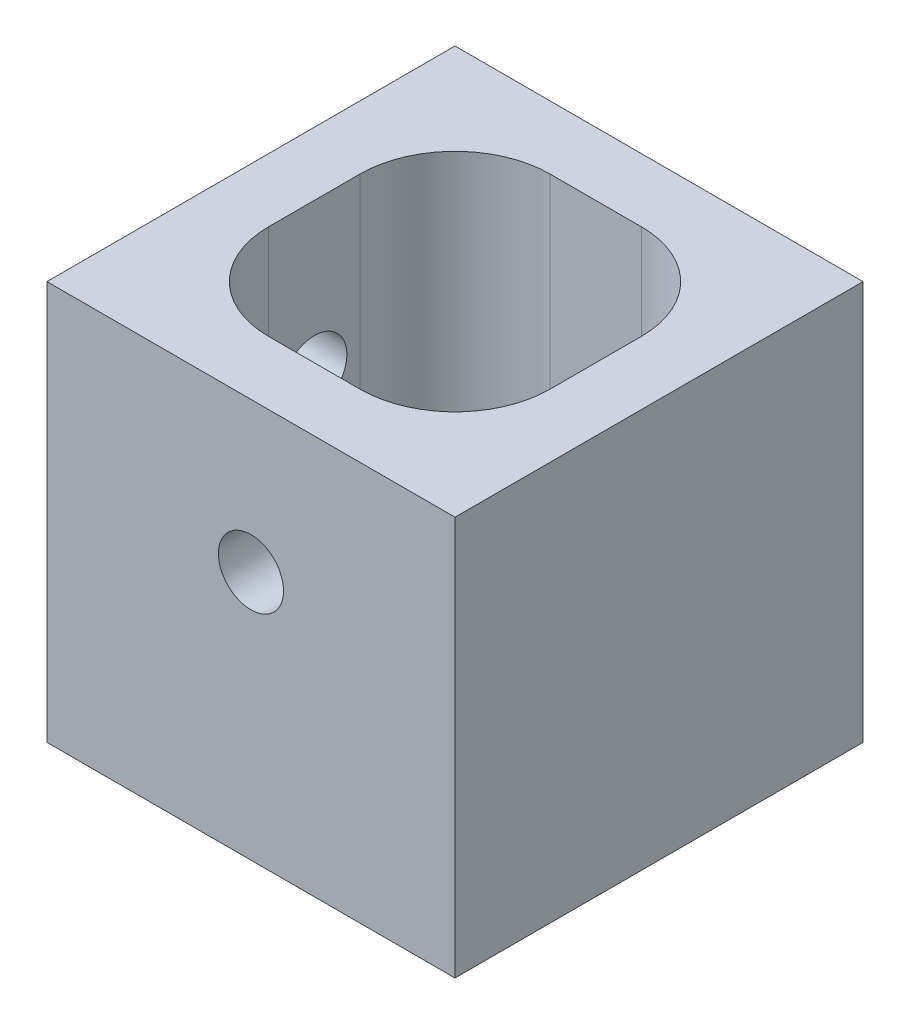
ISO-10303-21;
HEADER;
FILE_DESCRIPTION(('STEP AP214'),'2;1');
FILE_NAME('part.step','',(''),(''),'','','');
FILE_SCHEMA(('AUTOMOTIVE_DESIGN { 1 0 10303 214 1 1 1 1 }'));
ENDSEC;
DATA;
#1=APPLICATION_CONTEXT('core data for automotive mechanical design processes');
#2=APPLICATION_PROTOCOL_DEFINITION('international standard','automotive_design',2000,#1);
#3=PRODUCT_CONTEXT('',#1,'mechanical');
#4=PRODUCT('Part','Part','',(#3));
#5=PRODUCT_RELATED_PRODUCT_CATEGORY('part','',(#4));
#6=PRODUCT_DEFINITION_FORMATION('','',#4);
#7=PRODUCT_DEFINITION_CONTEXT('part definition',#1,'design');
#8=PRODUCT_DEFINITION('design','',#6,#7);
#9=PRODUCT_DEFINITION_SHAPE('','',#8);
#10=(LENGTH_UNIT() NAMED_UNIT(*) SI_UNIT(.MILLI.,.METRE.));
#11=(NAMED_UNIT(*) PLANE_ANGLE_UNIT() SI_UNIT($,.RADIAN.));
#12=(NAMED_UNIT(*) SI_UNIT($,.STERADIAN.) SOLID_ANGLE_UNIT());
#13=UNCERTAINTY_MEASURE_WITH_UNIT(LENGTH_MEASURE(1.E-05),#10,'distance_accuracy_value','');
#14=(GEOMETRIC_REPRESENTATION_CONTEXT(3) GLOBAL_UNCERTAINTY_ASSIGNED_CONTEXT((#13)) GLOBAL_UNIT_ASSIGNED_CONTEXT((#10,
#11,#12)) REPRESENTATION_CONTEXT('',''));
#15=CARTESIAN_POINT('',(0.,0.,0.));
#16=DIRECTION('',(0.,0.,1.));
#17=DIRECTION('',(1.,0.,0.));
#18=AXIS2_PLACEMENT_3D('',#15,#16,#17);
#19=CARTESIAN_POINT('',(0.,9.525,0.));
#20=DIRECTION('',(0.,-1.,0.));
#21=DIRECTION('',(0.,0.,-1.));
#22=AXIS2_PLACEMENT_3D('',#19,#20,#21);
#23=PLANE('',#22);
#24=CARTESIAN_POINT('',(-9.525,9.525,-9.525));
#25=DIRECTION('',(0.,1.,0.));
#26=DIRECTION('',(0.,0.,1.));
#27=AXIS2_PLACEMENT_3D('',#24,#25,#26);
#28=CIRCLE('',#27,2.55269999999999);
#29=CARTESIAN_POINT('',(-11.6142272356544,9.525,-10.9917674825275));
#30=VERTEX_POINT('',#29);
#31=CARTESIAN_POINT('',(-10.9917674825275,9.525,-11.6142272356544));
#32=VERTEX_POINT('',#31);
#33=EDGE_CURVE('E158',#30,#32,#28,.T.);
#34=ORIENTED_EDGE('',*,*,#33,.F.);
#35=CARTESIAN_POINT('',(-4.575,9.525,-4.575));
#36=DIRECTION('',(0.,-1.,0.));
#37=DIRECTION('',(0.,0.,-1.));
#38=AXIS2_PLACEMENT_3D('',#35,#36,#37);
#39=CIRCLE('',#38,9.525);
#40=CARTESIAN_POINT('',(-14.1,9.525,-4.575));
#41=VERTEX_POINT('',#40);
#42=EDGE_CURVE('E152',#30,#41,#39,.F.);
#43=ORIENTED_EDGE('',*,*,#42,.T.);
#44=DIRECTION('',(0.,0.,1.));
#45=VECTOR('',#44,1.);
#46=CARTESIAN_POINT('',(-14.1,9.525,14.1));
#47=LINE('',#46,#45);
#48=CARTESIAN_POINT('',(-14.1,9.525,4.575));
#49=VERTEX_POINT('',#48);
#50=EDGE_CURVE('E263',#41,#49,#47,.T.);
#51=ORIENTED_EDGE('',*,*,#50,.T.);
#52=CARTESIAN_POINT('',(-4.575,9.525,4.575));
#53=DIRECTION('',(0.,-1.,0.));
#54=DIRECTION('',(0.,0.,-1.));
#55=AXIS2_PLACEMENT_3D('',#52,#53,#54);
#56=CIRCLE('',#55,9.525);
#57=CARTESIAN_POINT('',(-11.6142272356544,9.525,10.9917674825274));
#58=VERTEX_POINT('',#57);
#59=EDGE_CURVE('E184',#49,#58,#56,.F.);
#60=ORIENTED_EDGE('',*,*,#59,.T.);
#61=CARTESIAN_POINT('',(-9.525,9.525,9.525));
#62=DIRECTION('',(0.,1.,0.));
#63=DIRECTION('',(0.,0.,1.));
#64=AXIS2_PLACEMENT_3D('',#61,#62,#63);
#65=CIRCLE('',#64,2.55269999999999);
#66=CARTESIAN_POINT('',(-10.9917674825275,9.525,11.6142272356543));
#67=VERTEX_POINT('',#66);
#68=EDGE_CURVE('E360',#67,#58,#65,.T.);
#69=ORIENTED_EDGE('',*,*,#68,.F.);
#70=CARTESIAN_POINT('',(-4.575,9.525,14.1));
#71=VERTEX_POINT('',#70);
#72=EDGE_CURVE('E180',#67,#71,#56,.F.);
#73=ORIENTED_EDGE('',*,*,#72,.T.);
#74=DIRECTION('',(1.,0.,0.));
#75=VECTOR('',#74,1.);
#76=CARTESIAN_POINT('',(14.1,9.525,14.1));
#77=LINE('',#76,#75);
#78=CARTESIAN_POINT('',(4.575,9.525,14.1));
#79=VERTEX_POINT('',#78);
#80=EDGE_CURVE('E253',#71,#79,#77,.T.);
#81=ORIENTED_EDGE('',*,*,#80,.T.);
#82=CARTESIAN_POINT('',(4.575,9.525,4.575));
#83=DIRECTION('',(0.,-1.,0.));
#84=DIRECTION('',(0.,0.,-1.));
#85=AXIS2_PLACEMENT_3D('',#82,#83,#84);
#86=CIRCLE('',#85,9.525);
#87=CARTESIAN_POINT('',(10.9917674825275,9.525,11.6142272356544));
#88=VERTEX_POINT('',#87);
#89=EDGE_CURVE('E195',#79,#88,#86,.F.);
#90=ORIENTED_EDGE('',*,*,#89,.T.);
#91=CARTESIAN_POINT('',(9.525,9.525,9.525));
#92=DIRECTION('',(0.,1.,0.));
#93=DIRECTION('',(0.,0.,1.));
#94=AXIS2_PLACEMENT_3D('',#91,#92,#93);
#95=CIRCLE('',#94,2.55269999999999);
#96=CARTESIAN_POINT('',(11.6142272356544,9.525,10.9917674825274));
#97=VERTEX_POINT('',#96);
#98=EDGE_CURVE('E582',#97,#88,#95,.T.);
#99=ORIENTED_EDGE('',*,*,#98,.F.);
#100=CARTESIAN_POINT('',(14.1,9.525,4.575));
#101=VERTEX_POINT('',#100);
#102=EDGE_CURVE('E192',#97,#101,#86,.F.);
#103=ORIENTED_EDGE('',*,*,#102,.T.);
#104=DIRECTION('',(0.,0.,-1.));
#105=VECTOR('',#104,1.);
#106=CARTESIAN_POINT('',(14.1,9.525,14.1));
#107=LINE('',#106,#105);
#108=CARTESIAN_POINT('',(14.1,9.525,-4.575));
#109=VERTEX_POINT('',#108);
#110=EDGE_CURVE('E262',#101,#109,#107,.T.);
#111=ORIENTED_EDGE('',*,*,#110,.T.);
#112=CARTESIAN_POINT('',(4.575,9.525,-4.575));
#113=DIRECTION('',(0.,-1.,0.));
#114=DIRECTION('',(0.,0.,-1.));
#115=AXIS2_PLACEMENT_3D('',#112,#113,#114);
#116=CIRCLE('',#115,9.525);
#117=CARTESIAN_POINT('',(11.6142272356544,9.525,-10.9917674825274));
#118=VERTEX_POINT('',#117);
#119=EDGE_CURVE('E174',#109,#118,#116,.F.);
#120=ORIENTED_EDGE('',*,*,#119,.T.);
#121=CARTESIAN_POINT('',(9.525,9.525,-9.525));
#122=DIRECTION('',(0.,1.,0.));
#123=DIRECTION('',(0.,0.,1.));
#124=AXIS2_PLACEMENT_3D('',#121,#122,#123);
#125=CIRCLE('',#124,2.55269999999999);
#126=CARTESIAN_POINT('',(10.9917674825275,9.525,-11.6142272356544));
#127=VERTEX_POINT('',#126);
#128=EDGE_CURVE('E589',#127,#118,#125,.T.);
#129=ORIENTED_EDGE('',*,*,#128,.F.);
#130=CARTESIAN_POINT('',(4.575,9.525,-14.1));
#131=VERTEX_POINT('',#130);
#132=EDGE_CURVE('E172',#127,#131,#116,.F.);
#133=ORIENTED_EDGE('',*,*,#132,.T.);
#134=DIRECTION('',(-1.,0.,0.));
#135=VECTOR('',#134,1.);
#136=CARTESIAN_POINT('',(14.1,9.525,-14.1));
#137=LINE('',#136,#135);
#138=CARTESIAN_POINT('',(-4.575,9.525,-14.1));
#139=VERTEX_POINT('',#138);
#140=EDGE_CURVE('E266',#131,#139,#137,.T.);
#141=ORIENTED_EDGE('',*,*,#140,.T.);
#142=EDGE_CURVE('E151',#139,#32,#39,.F.);
#143=ORIENTED_EDGE('',*,*,#142,.T.);
#144=EDGE_LOOP('',(#34,#43,#51,#60,#69,#73,#81,#90,#99,#103,#111,#120,#129,#133,#141,#143));
#145=FACE_BOUND('',#144,.T.);
#146=ADVANCED_FACE('F35',(#145),#23,.F.);
#147=CARTESIAN_POINT('',(20.45,40.,20.45));
#148=DIRECTION('',(-1.,0.,0.));
#149=DIRECTION('',(0.,0.,1.));
#150=AXIS2_PLACEMENT_3D('',#147,#148,#149);
#151=PLANE('',#150);
#152=DIRECTION('',(0.,0.,-1.));
#153=VECTOR('',#152,1.);
#154=CARTESIAN_POINT('',(20.45,0.,20.45));
#155=LINE('',#154,#153);
#156=CARTESIAN_POINT('',(20.45,0.,20.45));
#157=VERTEX_POINT('',#156);
#158=CARTESIAN_POINT('',(20.45,0.,-20.45));
#159=VERTEX_POINT('',#158);
#160=EDGE_CURVE('E265',#157,#159,#155,.T.);
#161=ORIENTED_EDGE('',*,*,#160,.T.);
#162=DIRECTION('',(0.,-1.,0.));
#163=VECTOR('',#162,1.);
#164=CARTESIAN_POINT('',(20.45,40.,-20.45));
#165=LINE('',#164,#163);
#166=CARTESIAN_POINT('',(20.45,40.,-20.45));
#167=VERTEX_POINT('',#166);
#168=EDGE_CURVE('E238',#167,#159,#165,.T.);
#169=ORIENTED_EDGE('',*,*,#168,.F.);
#170=DIRECTION('',(0.,0.,-1.));
#171=VECTOR('',#170,1.);
#172=CARTESIAN_POINT('',(20.45,40.,20.45));
#173=LINE('',#172,#171);
#174=CARTESIAN_POINT('',(20.45,40.,20.45));
#175=VERTEX_POINT('',#174);
#176=EDGE_CURVE('E269',#175,#167,#173,.T.);
#177=ORIENTED_EDGE('',*,*,#176,.F.);
#178=DIRECTION('',(0.,-1.,0.));
#179=VECTOR('',#178,1.);
#180=CARTESIAN_POINT('',(20.45,40.,20.45));
#181=LINE('',#180,#179);
#182=EDGE_CURVE('E279',#175,#157,#181,.T.);
#183=ORIENTED_EDGE('',*,*,#182,.T.);
#184=EDGE_LOOP('',(#161,#169,#177,#183));
#185=FACE_BOUND('',#184,.T.);
#186=ADVANCED_FACE('F309',(#185),#151,.F.);
#187=CARTESIAN_POINT('',(-20.45,40.,-20.45));
#188=DIRECTION('',(0.,0.,1.));
#189=DIRECTION('',(1.,0.,0.));
#190=AXIS2_PLACEMENT_3D('',#187,#188,#189);
#191=PLANE('',#190);
#192=DIRECTION('',(-1.,0.,0.));
#193=VECTOR('',#192,1.);
#194=CARTESIAN_POINT('',(-20.45,0.,-20.45));
#195=LINE('',#194,#193);
#196=CARTESIAN_POINT('',(-20.45,0.,-20.45));
#197=VERTEX_POINT('',#196);
#198=EDGE_CURVE('E282',#159,#197,#195,.T.);
#199=ORIENTED_EDGE('',*,*,#198,.T.);
#200=DIRECTION('',(0.,-1.,0.));
#201=VECTOR('',#200,1.);
#202=CARTESIAN_POINT('',(-20.45,40.,-20.45));
#203=LINE('',#202,#201);
#204=CARTESIAN_POINT('',(-20.45,40.,-20.45));
#205=VERTEX_POINT('',#204);
#206=EDGE_CURVE('E242',#205,#197,#203,.T.);
#207=ORIENTED_EDGE('',*,*,#206,.F.);
#208=DIRECTION('',(-1.,0.,0.));
#209=VECTOR('',#208,1.);
#210=CARTESIAN_POINT('',(-20.45,40.,-20.45));
#211=LINE('',#210,#209);
#212=EDGE_CURVE('E272',#167,#205,#211,.T.);
#213=ORIENTED_EDGE('',*,*,#212,.F.);
#214=ORIENTED_EDGE('',*,*,#168,.T.);
#215=EDGE_LOOP('',(#199,#207,#213,#214));
#216=FACE_BOUND('',#215,.T.);
#217=ADVANCED_FACE('F311',(#216),#191,.F.);
#218=CARTESIAN_POINT('',(-20.45,40.,20.45));
#219=DIRECTION('',(1.,0.,0.));
#220=DIRECTION('',(0.,0.,-1.));
#221=AXIS2_PLACEMENT_3D('',#218,#219,#220);
#222=PLANE('',#221);
#223=CARTESIAN_POINT('',(-20.45,25.,0.));
#224=DIRECTION('',(-1.,0.,0.));
#225=DIRECTION('',(0.,0.,1.));
#226=AXIS2_PLACEMENT_3D('',#223,#224,#225);
#227=CIRCLE('',#226,3.2639);
#228=CARTESIAN_POINT('',(-20.45,25.,3.26389999999993));
#229=VERTEX_POINT('',#228);
#230=EDGE_CURVE('E346',#229,#229,#227,.T.);
#231=ORIENTED_EDGE('',*,*,#230,.F.);
#232=EDGE_LOOP('',(#231));
#233=FACE_BOUND('',#232,.T.);
#234=DIRECTION('',(0.,0.,1.));
#235=VECTOR('',#234,1.);
#236=CARTESIAN_POINT('',(-20.45,0.,20.45));
#237=LINE('',#236,#235);
#238=CARTESIAN_POINT('',(-20.45,0.,20.45));
#239=VERTEX_POINT('',#238);
#240=EDGE_CURVE('E284',#197,#239,#237,.T.);
#241=ORIENTED_EDGE('',*,*,#240,.T.);
#242=DIRECTION('',(0.,-1.,0.));
#243=VECTOR('',#242,1.);
#244=CARTESIAN_POINT('',(-20.45,40.,20.45));
#245=LINE('',#244,#243);
#246=CARTESIAN_POINT('',(-20.45,40.,20.45));
#247=VERTEX_POINT('',#246);
#248=EDGE_CURVE('E289',#247,#239,#245,.T.);
#249=ORIENTED_EDGE('',*,*,#248,.F.);
#250=DIRECTION('',(0.,0.,1.));
#251=VECTOR('',#250,1.);
#252=CARTESIAN_POINT('',(-20.45,40.,20.45));
#253=LINE('',#252,#251);
#254=EDGE_CURVE('E275',#205,#247,#253,.T.);
#255=ORIENTED_EDGE('',*,*,#254,.F.);
#256=ORIENTED_EDGE('',*,*,#206,.T.);
#257=EDGE_LOOP('',(#241,#249,#255,#256));
#258=FACE_BOUND('',#257,.T.);
#259=ADVANCED_FACE('F296',(#233,#258),#222,.F.);
#260=CARTESIAN_POINT('',(-20.45,40.,20.45));
#261=DIRECTION('',(0.,0.,-1.));
#262=DIRECTION('',(-1.,0.,0.));
#263=AXIS2_PLACEMENT_3D('',#260,#261,#262);
#264=PLANE('',#263);
#265=CARTESIAN_POINT('',(0.,25.,20.45));
#266=DIRECTION('',(0.,0.,1.));
#267=DIRECTION('',(1.,0.,0.));
#268=AXIS2_PLACEMENT_3D('',#265,#266,#267);
#269=CIRCLE('',#268,3.2639);
#270=CARTESIAN_POINT('',(3.2639,25.,20.45));
#271=VERTEX_POINT('',#270);
#272=EDGE_CURVE('E339',#271,#271,#269,.T.);
#273=ORIENTED_EDGE('',*,*,#272,.F.);
#274=EDGE_LOOP('',(#273));
#275=FACE_BOUND('',#274,.T.);
#276=DIRECTION('',(1.,0.,0.));
#277=VECTOR('',#276,1.);
#278=CARTESIAN_POINT('',(-20.45,0.,20.45));
#279=LINE('',#278,#277);
#280=EDGE_CURVE('E273',#239,#157,#279,.T.);
#281=ORIENTED_EDGE('',*,*,#280,.T.);
#282=ORIENTED_EDGE('',*,*,#182,.F.);
#283=DIRECTION('',(1.,0.,0.));
#284=VECTOR('',#283,1.);
#285=CARTESIAN_POINT('',(-20.45,40.,20.45));
#286=LINE('',#285,#284);
#287=EDGE_CURVE('E277',#247,#175,#286,.T.);
#288=ORIENTED_EDGE('',*,*,#287,.F.);
#289=ORIENTED_EDGE('',*,*,#248,.T.);
#290=EDGE_LOOP('',(#281,#282,#288,#289));
#291=FACE_BOUND('',#290,.T.);
#292=ADVANCED_FACE('F305',(#275,#291),#264,.F.);
#293=CARTESIAN_POINT('',(0.,40.,0.));
#294=DIRECTION('',(0.,-1.,0.));
#295=DIRECTION('',(0.,0.,-1.));
#296=AXIS2_PLACEMENT_3D('',#293,#294,#295);
#297=PLANE('',#296);
#298=DIRECTION('',(0.,0.,-1.));
#299=VECTOR('',#298,1.);
#300=CARTESIAN_POINT('',(14.1,40.,14.1));
#301=LINE('',#300,#299);
#302=CARTESIAN_POINT('',(14.1,40.,4.575));
#303=VERTEX_POINT('',#302);
#304=CARTESIAN_POINT('',(14.1,40.,-4.575));
#305=VERTEX_POINT('',#304);
#306=EDGE_CURVE('E222',#303,#305,#301,.T.);
#307=ORIENTED_EDGE('',*,*,#306,.F.);
#308=CARTESIAN_POINT('',(4.575,40.,4.575));
#309=DIRECTION('',(0.,-1.,0.));
#310=DIRECTION('',(0.,0.,-1.));
#311=AXIS2_PLACEMENT_3D('',#308,#309,#310);
#312=CIRCLE('',#311,9.525);
#313=CARTESIAN_POINT('',(4.575,40.,14.1));
#314=VERTEX_POINT('',#313);
#315=EDGE_CURVE('E213',#303,#314,#312,.T.);
#316=ORIENTED_EDGE('',*,*,#315,.T.);
#317=DIRECTION('',(1.,0.,0.));
#318=VECTOR('',#317,1.);
#319=CARTESIAN_POINT('',(14.1,40.,14.1));
#320=LINE('',#319,#318);
#321=CARTESIAN_POINT('',(-4.575,40.,14.1));
#322=VERTEX_POINT('',#321);
#323=EDGE_CURVE('E234',#322,#314,#320,.T.);
#324=ORIENTED_EDGE('',*,*,#323,.F.);
#325=CARTESIAN_POINT('',(-4.575,40.,4.575));
#326=DIRECTION('',(0.,-1.,0.));
#327=DIRECTION('',(0.,0.,-1.));
#328=AXIS2_PLACEMENT_3D('',#325,#326,#327);
#329=CIRCLE('',#328,9.525);
#330=CARTESIAN_POINT('',(-14.1,40.,4.575));
#331=VERTEX_POINT('',#330);
#332=EDGE_CURVE('E215',#322,#331,#329,.T.);
#333=ORIENTED_EDGE('',*,*,#332,.T.);
#334=DIRECTION('',(0.,0.,1.));
#335=VECTOR('',#334,1.);
#336=CARTESIAN_POINT('',(-14.1,40.,14.1));
#337=LINE('',#336,#335);
#338=CARTESIAN_POINT('',(-14.1,40.,-4.575));
#339=VERTEX_POINT('',#338);
#340=EDGE_CURVE('E255',#339,#331,#337,.T.);
#341=ORIENTED_EDGE('',*,*,#340,.F.);
#342=CARTESIAN_POINT('',(-4.575,40.,-4.575));
#343=DIRECTION('',(0.,-1.,0.));
#344=DIRECTION('',(0.,0.,-1.));
#345=AXIS2_PLACEMENT_3D('',#342,#343,#344);
#346=CIRCLE('',#345,9.525);
#347=CARTESIAN_POINT('',(-4.575,40.,-14.1));
#348=VERTEX_POINT('',#347);
#349=EDGE_CURVE('E11',#339,#348,#346,.T.);
#350=ORIENTED_EDGE('',*,*,#349,.T.);
#351=DIRECTION('',(-1.,0.,0.));
#352=VECTOR('',#351,1.);
#353=CARTESIAN_POINT('',(14.1,40.,-14.1));
#354=LINE('',#353,#352);
#355=CARTESIAN_POINT('',(4.575,40.,-14.1));
#356=VERTEX_POINT('',#355);
#357=EDGE_CURVE('E224',#356,#348,#354,.T.);
#358=ORIENTED_EDGE('',*,*,#357,.F.);
#359=CARTESIAN_POINT('',(4.575,40.,-4.575));
#360=DIRECTION('',(0.,-1.,0.));
#361=DIRECTION('',(0.,0.,-1.));
#362=AXIS2_PLACEMENT_3D('',#359,#360,#361);
#363=CIRCLE('',#362,9.525);
#364=EDGE_CURVE('E43',#356,#305,#363,.T.);
#365=ORIENTED_EDGE('',*,*,#364,.T.);
#366=EDGE_LOOP('',(#307,#316,#324,#333,#341,#350,#358,#365));
#367=FACE_BOUND('',#366,.T.);
#368=ORIENTED_EDGE('',*,*,#176,.T.);
#369=ORIENTED_EDGE('',*,*,#212,.T.);
#370=ORIENTED_EDGE('',*,*,#254,.T.);
#371=ORIENTED_EDGE('',*,*,#287,.T.);
#372=EDGE_LOOP('',(#368,#369,#370,#371));
#373=FACE_BOUND('',#372,.T.);
#374=ADVANCED_FACE('F220',(#367,#373),#297,.F.);
#375=CARTESIAN_POINT('',(0.,0.,0.));
#376=DIRECTION('',(0.,-1.,0.));
#377=DIRECTION('',(0.,0.,-1.));
#378=AXIS2_PLACEMENT_3D('',#375,#376,#377);
#379=PLANE('',#378);
#380=CARTESIAN_POINT('',(-9.525,0.,-9.525));
#381=DIRECTION('',(0.,-1.,0.));
#382=DIRECTION('',(0.,0.,-1.));
#383=AXIS2_PLACEMENT_3D('',#380,#381,#382);
#384=CIRCLE('',#383,2.55269999999999);
#385=CARTESIAN_POINT('',(-9.525,0.,-12.0777));
#386=VERTEX_POINT('',#385);
#387=EDGE_CURVE('E159',#386,#386,#384,.T.);
#388=ORIENTED_EDGE('',*,*,#387,.F.);
#389=EDGE_LOOP('',(#388));
#390=FACE_BOUND('',#389,.T.);
#391=CARTESIAN_POINT('',(9.525,0.,-9.525));
#392=DIRECTION('',(0.,-1.,0.));
#393=DIRECTION('',(0.,0.,-1.));
#394=AXIS2_PLACEMENT_3D('',#391,#392,#393);
#395=CIRCLE('',#394,2.55269999999999);
#396=CARTESIAN_POINT('',(9.525,0.,-12.0777));
#397=VERTEX_POINT('',#396);
#398=EDGE_CURVE('E584',#397,#397,#395,.T.);
#399=ORIENTED_EDGE('',*,*,#398,.F.);
#400=EDGE_LOOP('',(#399));
#401=FACE_BOUND('',#400,.T.);
#402=CARTESIAN_POINT('',(9.525,0.,9.525));
#403=DIRECTION('',(0.,-1.,0.));
#404=DIRECTION('',(0.,0.,-1.));
#405=AXIS2_PLACEMENT_3D('',#402,#403,#404);
#406=CIRCLE('',#405,2.55269999999999);
#407=CARTESIAN_POINT('',(9.525,0.,6.9723));
#408=VERTEX_POINT('',#407);
#409=EDGE_CURVE('E362',#408,#408,#406,.T.);
#410=ORIENTED_EDGE('',*,*,#409,.F.);
#411=EDGE_LOOP('',(#410));
#412=FACE_BOUND('',#411,.T.);
#413=CARTESIAN_POINT('',(-9.525,0.,9.525));
#414=DIRECTION('',(0.,-1.,0.));
#415=DIRECTION('',(0.,0.,-1.));
#416=AXIS2_PLACEMENT_3D('',#413,#414,#415);
#417=CIRCLE('',#416,2.55269999999999);
#418=CARTESIAN_POINT('',(-9.525,0.,6.9723));
#419=VERTEX_POINT('',#418);
#420=EDGE_CURVE('E364',#419,#419,#417,.T.);
#421=ORIENTED_EDGE('',*,*,#420,.F.);
#422=EDGE_LOOP('',(#421));
#423=FACE_BOUND('',#422,.T.);
#424=ORIENTED_EDGE('',*,*,#160,.F.);
#425=ORIENTED_EDGE('',*,*,#280,.F.);
#426=ORIENTED_EDGE('',*,*,#240,.F.);
#427=ORIENTED_EDGE('',*,*,#198,.F.);
#428=EDGE_LOOP('',(#424,#425,#426,#427));
#429=FACE_BOUND('',#428,.T.);
#430=ADVANCED_FACE('F302',(#390,#401,#412,#423,#429),#379,.T.);
#431=CARTESIAN_POINT('',(14.1,-30.3558224589213,14.1));
#432=DIRECTION('',(0.,0.,1.));
#433=DIRECTION('',(1.,0.,0.));
#434=AXIS2_PLACEMENT_3D('',#431,#432,#433);
#435=PLANE('',#434);
#436=CARTESIAN_POINT('',(0.,25.,14.1));
#437=DIRECTION('',(0.,0.,1.));
#438=DIRECTION('',(1.,0.,0.));
#439=AXIS2_PLACEMENT_3D('',#436,#437,#438);
#440=CIRCLE('',#439,3.2639);
#441=CARTESIAN_POINT('',(3.2639,25.,14.1));
#442=VERTEX_POINT('',#441);
#443=EDGE_CURVE('E257',#442,#442,#440,.T.);
#444=ORIENTED_EDGE('',*,*,#443,.T.);
#445=EDGE_LOOP('',(#444));
#446=FACE_BOUND('',#445,.T.);
#447=ORIENTED_EDGE('',*,*,#323,.T.);
#448=DIRECTION('',(0.,1.,0.));
#449=VECTOR('',#448,1.);
#450=CARTESIAN_POINT('',(4.575,9.525,14.1));
#451=LINE('',#450,#449);
#452=EDGE_CURVE('E168',#314,#79,#451,.F.);
#453=ORIENTED_EDGE('',*,*,#452,.T.);
#454=ORIENTED_EDGE('',*,*,#80,.F.);
#455=DIRECTION('',(0.,1.,0.));
#456=VECTOR('',#455,1.);
#457=CARTESIAN_POINT('',(-4.575,40.,14.1));
#458=LINE('',#457,#456);
#459=EDGE_CURVE('E169',#71,#322,#458,.T.);
#460=ORIENTED_EDGE('',*,*,#459,.T.);
#461=EDGE_LOOP('',(#447,#453,#454,#460));
#462=FACE_BOUND('',#461,.T.);
#463=ADVANCED_FACE('F251',(#446,#462),#435,.F.);
#464=CARTESIAN_POINT('',(14.1,-30.3558224589213,14.1));
#465=DIRECTION('',(1.,0.,0.));
#466=DIRECTION('',(0.,0.,-1.));
#467=AXIS2_PLACEMENT_3D('',#464,#465,#466);
#468=PLANE('',#467);
#469=ORIENTED_EDGE('',*,*,#110,.F.);
#470=DIRECTION('',(0.,1.,0.));
#471=VECTOR('',#470,1.);
#472=CARTESIAN_POINT('',(14.1,40.,4.575));
#473=LINE('',#472,#471);
#474=EDGE_CURVE('E233',#101,#303,#473,.T.);
#475=ORIENTED_EDGE('',*,*,#474,.T.);
#476=ORIENTED_EDGE('',*,*,#306,.T.);
#477=DIRECTION('',(0.,1.,0.));
#478=VECTOR('',#477,1.);
#479=CARTESIAN_POINT('',(14.1,9.525,-4.575));
#480=LINE('',#479,#478);
#481=EDGE_CURVE('E231',#305,#109,#480,.F.);
#482=ORIENTED_EDGE('',*,*,#481,.T.);
#483=EDGE_LOOP('',(#469,#475,#476,#482));
#484=FACE_BOUND('',#483,.T.);
#485=ADVANCED_FACE('F230',(#484),#468,.F.);
#486=CARTESIAN_POINT('',(14.1,-30.3558224589213,-14.1));
#487=DIRECTION('',(0.,0.,-1.));
#488=DIRECTION('',(-1.,0.,0.));
#489=AXIS2_PLACEMENT_3D('',#486,#487,#488);
#490=PLANE('',#489);
#491=ORIENTED_EDGE('',*,*,#140,.F.);
#492=DIRECTION('',(0.,1.,0.));
#493=VECTOR('',#492,1.);
#494=CARTESIAN_POINT('',(4.575,40.,-14.1));
#495=LINE('',#494,#493);
#496=EDGE_CURVE('E210',#131,#356,#495,.T.);
#497=ORIENTED_EDGE('',*,*,#496,.T.);
#498=ORIENTED_EDGE('',*,*,#357,.T.);
#499=DIRECTION('',(0.,1.,0.));
#500=VECTOR('',#499,1.);
#501=CARTESIAN_POINT('',(-4.575,9.525,-14.1));
#502=LINE('',#501,#500);
#503=EDGE_CURVE('E206',#348,#139,#502,.F.);
#504=ORIENTED_EDGE('',*,*,#503,.T.);
#505=EDGE_LOOP('',(#491,#497,#498,#504));
#506=FACE_BOUND('',#505,.T.);
#507=ADVANCED_FACE('F351',(#506),#490,.F.);
#508=CARTESIAN_POINT('',(-14.1,-30.3558224589213,14.1));
#509=DIRECTION('',(-1.,0.,0.));
#510=DIRECTION('',(0.,0.,1.));
#511=AXIS2_PLACEMENT_3D('',#508,#509,#510);
#512=PLANE('',#511);
#513=CARTESIAN_POINT('',(-14.1,25.,0.));
#514=DIRECTION('',(-1.,0.,0.));
#515=DIRECTION('',(0.,0.,1.));
#516=AXIS2_PLACEMENT_3D('',#513,#514,#515);
#517=CIRCLE('',#516,3.2639);
#518=CARTESIAN_POINT('',(-14.1,25.,3.26389999999995));
#519=VERTEX_POINT('',#518);
#520=EDGE_CURVE('E341',#519,#519,#517,.T.);
#521=ORIENTED_EDGE('',*,*,#520,.T.);
#522=EDGE_LOOP('',(#521));
#523=FACE_BOUND('',#522,.T.);
#524=ORIENTED_EDGE('',*,*,#340,.T.);
#525=DIRECTION('',(0.,1.,0.));
#526=VECTOR('',#525,1.);
#527=CARTESIAN_POINT('',(-14.1,9.525,4.575));
#528=LINE('',#527,#526);
#529=EDGE_CURVE('E202',#331,#49,#528,.F.);
#530=ORIENTED_EDGE('',*,*,#529,.T.);
#531=ORIENTED_EDGE('',*,*,#50,.F.);
#532=DIRECTION('',(0.,1.,0.));
#533=VECTOR('',#532,1.);
#534=CARTESIAN_POINT('',(-14.1,40.,-4.575));
#535=LINE('',#534,#533);
#536=EDGE_CURVE('E167',#41,#339,#535,.T.);
#537=ORIENTED_EDGE('',*,*,#536,.T.);
#538=EDGE_LOOP('',(#524,#530,#531,#537));
#539=FACE_BOUND('',#538,.T.);
#540=ADVANCED_FACE('F353',(#523,#539),#512,.F.);
#541=CARTESIAN_POINT('',(4.575,-30.3558224589213,4.575));
#542=DIRECTION('',(0.,-1.,0.));
#543=DIRECTION('',(0.,0.,-1.));
#544=AXIS2_PLACEMENT_3D('',#541,#542,#543);
#545=CYLINDRICAL_SURFACE('',#544,9.525);
#546=ORIENTED_EDGE('',*,*,#89,.F.);
#547=ORIENTED_EDGE('',*,*,#452,.F.);
#548=ORIENTED_EDGE('',*,*,#315,.F.);
#549=ORIENTED_EDGE('',*,*,#474,.F.);
#550=ORIENTED_EDGE('',*,*,#102,.F.);
#551=EDGE_CURVE('E194',#88,#97,#86,.F.);
#552=ORIENTED_EDGE('',*,*,#551,.F.);
#553=EDGE_LOOP('',(#546,#547,#548,#549,#550,#552));
#554=FACE_BOUND('',#553,.T.);
#555=ADVANCED_FACE('F382',(#554),#545,.F.);
#556=CARTESIAN_POINT('',(-4.575,-30.3558224589213,4.575));
#557=DIRECTION('',(0.,-1.,0.));
#558=DIRECTION('',(0.,0.,-1.));
#559=AXIS2_PLACEMENT_3D('',#556,#557,#558);
#560=CYLINDRICAL_SURFACE('',#559,9.525);
#561=ORIENTED_EDGE('',*,*,#59,.F.);
#562=ORIENTED_EDGE('',*,*,#529,.F.);
#563=ORIENTED_EDGE('',*,*,#332,.F.);
#564=ORIENTED_EDGE('',*,*,#459,.F.);
#565=ORIENTED_EDGE('',*,*,#72,.F.);
#566=EDGE_CURVE('E183',#58,#67,#56,.F.);
#567=ORIENTED_EDGE('',*,*,#566,.F.);
#568=EDGE_LOOP('',(#561,#562,#563,#564,#565,#567));
#569=FACE_BOUND('',#568,.T.);
#570=ADVANCED_FACE('F354',(#569),#560,.F.);
#571=CARTESIAN_POINT('',(4.575,-30.3558224589213,-4.575));
#572=DIRECTION('',(0.,-1.,0.));
#573=DIRECTION('',(0.,0.,-1.));
#574=AXIS2_PLACEMENT_3D('',#571,#572,#573);
#575=CYLINDRICAL_SURFACE('',#574,9.525);
#576=ORIENTED_EDGE('',*,*,#119,.F.);
#577=ORIENTED_EDGE('',*,*,#481,.F.);
#578=ORIENTED_EDGE('',*,*,#364,.F.);
#579=ORIENTED_EDGE('',*,*,#496,.F.);
#580=ORIENTED_EDGE('',*,*,#132,.F.);
#581=EDGE_CURVE('E173',#118,#127,#116,.F.);
#582=ORIENTED_EDGE('',*,*,#581,.F.);
#583=EDGE_LOOP('',(#576,#577,#578,#579,#580,#582));
#584=FACE_BOUND('',#583,.T.);
#585=ADVANCED_FACE('F236',(#584),#575,.F.);
#586=CARTESIAN_POINT('',(-4.575,-30.3558224589213,-4.575));
#587=DIRECTION('',(0.,-1.,0.));
#588=DIRECTION('',(0.,0.,-1.));
#589=AXIS2_PLACEMENT_3D('',#586,#587,#588);
#590=CYLINDRICAL_SURFACE('',#589,9.525);
#591=ORIENTED_EDGE('',*,*,#142,.F.);
#592=ORIENTED_EDGE('',*,*,#503,.F.);
#593=ORIENTED_EDGE('',*,*,#349,.F.);
#594=ORIENTED_EDGE('',*,*,#536,.F.);
#595=ORIENTED_EDGE('',*,*,#42,.F.);
#596=EDGE_CURVE('E145',#32,#30,#39,.F.);
#597=ORIENTED_EDGE('',*,*,#596,.F.);
#598=EDGE_LOOP('',(#591,#592,#593,#594,#595,#597));
#599=FACE_BOUND('',#598,.T.);
#600=ADVANCED_FACE('F37',(#599),#590,.F.);
#601=CARTESIAN_POINT('',(0.,25.,20.45));
#602=DIRECTION('',(0.,0.,1.));
#603=DIRECTION('',(1.,0.,0.));
#604=AXIS2_PLACEMENT_3D('',#601,#602,#603);
#605=CYLINDRICAL_SURFACE('',#604,3.2639);
#606=ORIENTED_EDGE('',*,*,#272,.T.);
#607=EDGE_LOOP('',(#606));
#608=FACE_BOUND('',#607,.T.);
#609=ORIENTED_EDGE('',*,*,#443,.F.);
#610=EDGE_LOOP('',(#609));
#611=FACE_BOUND('',#610,.T.);
#612=ADVANCED_FACE('F377',(#608,#611),#605,.F.);
#613=CARTESIAN_POINT('',(-20.45,25.,0.));
#614=DIRECTION('',(-1.,0.,0.));
#615=DIRECTION('',(0.,0.,1.));
#616=AXIS2_PLACEMENT_3D('',#613,#614,#615);
#617=CYLINDRICAL_SURFACE('',#616,3.2639);
#618=ORIENTED_EDGE('',*,*,#230,.T.);
#619=EDGE_LOOP('',(#618));
#620=FACE_BOUND('',#619,.T.);
#621=ORIENTED_EDGE('',*,*,#520,.F.);
#622=EDGE_LOOP('',(#621));
#623=FACE_BOUND('',#622,.T.);
#624=ADVANCED_FACE('F374',(#620,#623),#617,.F.);
#625=CARTESIAN_POINT('',(-6.97230000000001,9.525,9.525));
#626=DIRECTION('',(0.,1.,0.));
#627=DIRECTION('',(0.,0.,1.));
#628=AXIS2_PLACEMENT_3D('',#625,#626,#627);
#629=PLANE('',#628);
#630=EDGE_CURVE('E359',#58,#67,#65,.T.);
#631=ORIENTED_EDGE('',*,*,#630,.F.);
#632=ORIENTED_EDGE('',*,*,#566,.T.);
#633=EDGE_LOOP('',(#631,#632));
#634=FACE_BOUND('',#633,.T.);
#635=ADVANCED_FACE('F358',(#634),#629,.F.);
#636=CARTESIAN_POINT('',(-9.525,9.525,9.525));
#637=DIRECTION('',(0.,1.,0.));
#638=DIRECTION('',(0.,0.,1.));
#639=AXIS2_PLACEMENT_3D('',#636,#637,#638);
#640=CYLINDRICAL_SURFACE('',#639,2.55269999999999);
#641=ORIENTED_EDGE('',*,*,#630,.T.);
#642=ORIENTED_EDGE('',*,*,#68,.T.);
#643=EDGE_LOOP('',(#641,#642));
#644=FACE_BOUND('',#643,.T.);
#645=ORIENTED_EDGE('',*,*,#420,.T.);
#646=EDGE_LOOP('',(#645));
#647=FACE_BOUND('',#646,.T.);
#648=ADVANCED_FACE('F528',(#644,#647),#640,.F.);
#649=CARTESIAN_POINT('',(12.0777,9.525,9.525));
#650=DIRECTION('',(0.,1.,0.));
#651=DIRECTION('',(0.,0.,1.));
#652=AXIS2_PLACEMENT_3D('',#649,#650,#651);
#653=PLANE('',#652);
#654=EDGE_CURVE('E366',#88,#97,#95,.T.);
#655=ORIENTED_EDGE('',*,*,#654,.F.);
#656=ORIENTED_EDGE('',*,*,#551,.T.);
#657=EDGE_LOOP('',(#655,#656));
#658=FACE_BOUND('',#657,.T.);
#659=ADVANCED_FACE('F520',(#658),#653,.F.);
#660=CARTESIAN_POINT('',(9.525,9.525,9.525));
#661=DIRECTION('',(0.,1.,0.));
#662=DIRECTION('',(0.,0.,1.));
#663=AXIS2_PLACEMENT_3D('',#660,#661,#662);
#664=CYLINDRICAL_SURFACE('',#663,2.55269999999999);
#665=ORIENTED_EDGE('',*,*,#654,.T.);
#666=ORIENTED_EDGE('',*,*,#98,.T.);
#667=EDGE_LOOP('',(#665,#666));
#668=FACE_BOUND('',#667,.T.);
#669=ORIENTED_EDGE('',*,*,#409,.T.);
#670=EDGE_LOOP('',(#669));
#671=FACE_BOUND('',#670,.T.);
#672=ADVANCED_FACE('F516',(#668,#671),#664,.F.);
#673=CARTESIAN_POINT('',(12.0777,9.525,-9.525));
#674=DIRECTION('',(0.,1.,0.));
#675=DIRECTION('',(0.,0.,1.));
#676=AXIS2_PLACEMENT_3D('',#673,#674,#675);
#677=PLANE('',#676);
#678=EDGE_CURVE('E56',#118,#127,#125,.T.);
#679=ORIENTED_EDGE('',*,*,#678,.F.);
#680=ORIENTED_EDGE('',*,*,#581,.T.);
#681=EDGE_LOOP('',(#679,#680));
#682=FACE_BOUND('',#681,.T.);
#683=ADVANCED_FACE('F508',(#682),#677,.F.);
#684=CARTESIAN_POINT('',(9.525,9.525,-9.525));
#685=DIRECTION('',(0.,1.,0.));
#686=DIRECTION('',(0.,0.,1.));
#687=AXIS2_PLACEMENT_3D('',#684,#685,#686);
#688=CYLINDRICAL_SURFACE('',#687,2.55269999999999);
#689=ORIENTED_EDGE('',*,*,#678,.T.);
#690=ORIENTED_EDGE('',*,*,#128,.T.);
#691=EDGE_LOOP('',(#689,#690));
#692=FACE_BOUND('',#691,.T.);
#693=ORIENTED_EDGE('',*,*,#398,.T.);
#694=EDGE_LOOP('',(#693));
#695=FACE_BOUND('',#694,.T.);
#696=ADVANCED_FACE('F503',(#692,#695),#688,.F.);
#697=CARTESIAN_POINT('',(-6.97230000000001,9.525,-9.525));
#698=DIRECTION('',(0.,1.,0.));
#699=DIRECTION('',(0.,0.,1.));
#700=AXIS2_PLACEMENT_3D('',#697,#698,#699);
#701=PLANE('',#700);
#702=EDGE_CURVE('E49',#32,#30,#28,.T.);
#703=ORIENTED_EDGE('',*,*,#702,.F.);
#704=ORIENTED_EDGE('',*,*,#596,.T.);
#705=EDGE_LOOP('',(#703,#704));
#706=FACE_BOUND('',#705,.T.);
#707=ADVANCED_FACE('F146',(#706),#701,.F.);
#708=CARTESIAN_POINT('',(-9.525,9.525,-9.525));
#709=DIRECTION('',(0.,1.,0.));
#710=DIRECTION('',(0.,0.,1.));
#711=AXIS2_PLACEMENT_3D('',#708,#709,#710);
#712=CYLINDRICAL_SURFACE('',#711,2.55269999999999);
#713=ORIENTED_EDGE('',*,*,#702,.T.);
#714=ORIENTED_EDGE('',*,*,#33,.T.);
#715=EDGE_LOOP('',(#713,#714));
#716=FACE_BOUND('',#715,.T.);
#717=ORIENTED_EDGE('',*,*,#387,.T.);
#718=EDGE_LOOP('',(#717));
#719=FACE_BOUND('',#718,.T.);
#720=ADVANCED_FACE('F156',(#716,#719),#712,.F.);
#721=CLOSED_SHELL('',(#146,#186,#217,#259,#292,#374,#430,#463,#485,#507,#540,#555,#570,#585,
#600,#612,#624,#635,#648,#659,#672,#683,#696,#707,#720));
#722=MANIFOLD_SOLID_BREP('B2',#721);
#723=ADVANCED_BREP_SHAPE_REPRESENTATION('',(#18,#722),#14);
#724=SHAPE_DEFINITION_REPRESENTATION(#9,#723);
ENDSEC;
END-ISO-10303-21;
